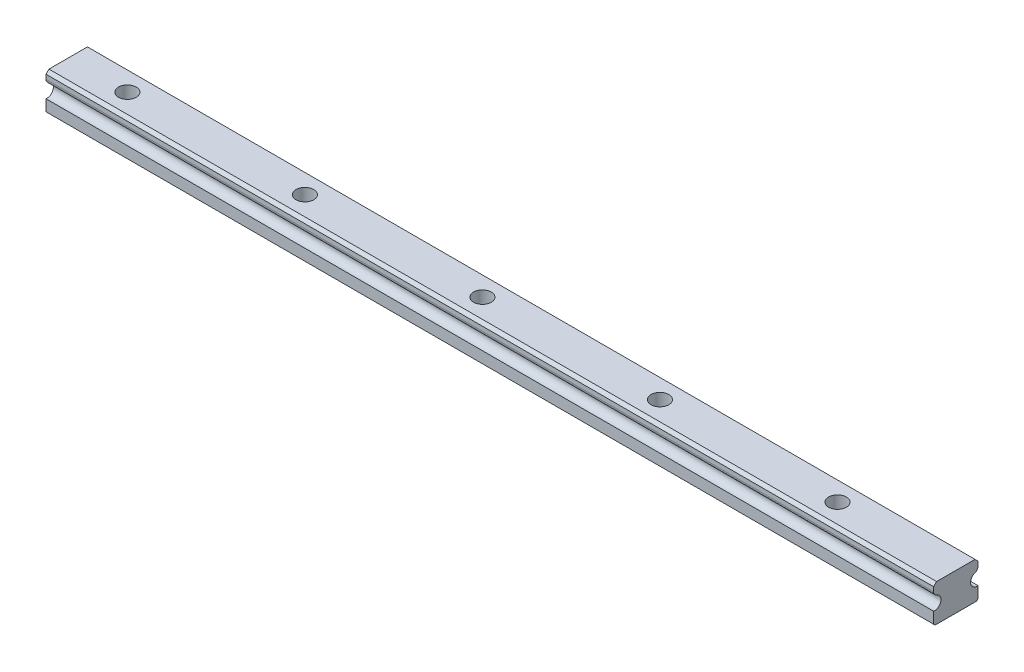
ISO-10303-21;
HEADER;
FILE_DESCRIPTION(('STEP AP214'),'2;1');
FILE_NAME('part.step','',(''),(''),'','','');
FILE_SCHEMA(('AUTOMOTIVE_DESIGN { 1 0 10303 214 1 1 1 1 }'));
ENDSEC;
DATA;
#1=APPLICATION_CONTEXT('core data for automotive mechanical design processes');
#2=APPLICATION_PROTOCOL_DEFINITION('international standard','automotive_design',2000,#1);
#3=PRODUCT_CONTEXT('',#1,'mechanical');
#4=PRODUCT('Part','Part','',(#3));
#5=PRODUCT_RELATED_PRODUCT_CATEGORY('part','',(#4));
#6=PRODUCT_DEFINITION_FORMATION('','',#4);
#7=PRODUCT_DEFINITION_CONTEXT('part definition',#1,'design');
#8=PRODUCT_DEFINITION('design','',#6,#7);
#9=PRODUCT_DEFINITION_SHAPE('','',#8);
#10=(LENGTH_UNIT() NAMED_UNIT(*) SI_UNIT(.MILLI.,.METRE.));
#11=(NAMED_UNIT(*) PLANE_ANGLE_UNIT() SI_UNIT($,.RADIAN.));
#12=(NAMED_UNIT(*) SI_UNIT($,.STERADIAN.) SOLID_ANGLE_UNIT());
#13=UNCERTAINTY_MEASURE_WITH_UNIT(LENGTH_MEASURE(1.E-05),#10,'distance_accuracy_value','');
#14=(GEOMETRIC_REPRESENTATION_CONTEXT(3) GLOBAL_UNCERTAINTY_ASSIGNED_CONTEXT((#13)) GLOBAL_UNIT_ASSIGNED_CONTEXT((#10,
#11,#12)) REPRESENTATION_CONTEXT('',''));
#15=CARTESIAN_POINT('',(0.,0.,0.));
#16=DIRECTION('',(0.,0.,1.));
#17=DIRECTION('',(1.,0.,0.));
#18=AXIS2_PLACEMENT_3D('',#15,#16,#17);
#19=CARTESIAN_POINT('',(476.,21.25,-11.05));
#20=DIRECTION('',(0.,-1.,0.));
#21=DIRECTION('',(0.,0.,-1.));
#22=AXIS2_PLACEMENT_3D('',#19,#20,#21);
#23=PLANE('',#22);
#24=CARTESIAN_POINT('',(0.,21.25,0.));
#25=DIRECTION('',(0.,1.,0.));
#26=DIRECTION('',(0.,0.,1.));
#27=AXIS2_PLACEMENT_3D('',#24,#25,#26);
#28=CIRCLE('',#27,5.1);
#29=CARTESIAN_POINT('',(0.,21.25,5.1));
#30=VERTEX_POINT('',#29);
#31=EDGE_CURVE('E291',#30,#30,#28,.T.);
#32=ORIENTED_EDGE('',*,*,#31,.F.);
#33=EDGE_LOOP('',(#32));
#34=FACE_BOUND('',#33,.T.);
#35=CARTESIAN_POINT('',(102.,21.25,0.));
#36=DIRECTION('',(0.,1.,0.));
#37=DIRECTION('',(0.,0.,1.));
#38=AXIS2_PLACEMENT_3D('',#35,#36,#37);
#39=CIRCLE('',#38,5.1);
#40=CARTESIAN_POINT('',(102.,21.25,5.1));
#41=VERTEX_POINT('',#40);
#42=EDGE_CURVE('E295',#41,#41,#39,.T.);
#43=ORIENTED_EDGE('',*,*,#42,.F.);
#44=EDGE_LOOP('',(#43));
#45=FACE_BOUND('',#44,.T.);
#46=CARTESIAN_POINT('',(204.,21.25,0.));
#47=DIRECTION('',(0.,1.,0.));
#48=DIRECTION('',(0.,0.,1.));
#49=AXIS2_PLACEMENT_3D('',#46,#47,#48);
#50=CIRCLE('',#49,5.1);
#51=CARTESIAN_POINT('',(204.,21.25,5.1));
#52=VERTEX_POINT('',#51);
#53=EDGE_CURVE('E299',#52,#52,#50,.T.);
#54=ORIENTED_EDGE('',*,*,#53,.F.);
#55=EDGE_LOOP('',(#54));
#56=FACE_BOUND('',#55,.T.);
#57=CARTESIAN_POINT('',(306.,21.25,0.));
#58=DIRECTION('',(0.,1.,0.));
#59=DIRECTION('',(0.,0.,1.));
#60=AXIS2_PLACEMENT_3D('',#57,#58,#59);
#61=CIRCLE('',#60,5.1);
#62=CARTESIAN_POINT('',(306.,21.25,5.1));
#63=VERTEX_POINT('',#62);
#64=EDGE_CURVE('E303',#63,#63,#61,.T.);
#65=ORIENTED_EDGE('',*,*,#64,.F.);
#66=EDGE_LOOP('',(#65));
#67=FACE_BOUND('',#66,.T.);
#68=CARTESIAN_POINT('',(408.,21.25,0.));
#69=DIRECTION('',(0.,1.,0.));
#70=DIRECTION('',(0.,0.,1.));
#71=AXIS2_PLACEMENT_3D('',#68,#69,#70);
#72=CIRCLE('',#71,5.1);
#73=CARTESIAN_POINT('',(408.,21.25,5.1));
#74=VERTEX_POINT('',#73);
#75=EDGE_CURVE('E306',#74,#74,#72,.T.);
#76=ORIENTED_EDGE('',*,*,#75,.F.);
#77=EDGE_LOOP('',(#76));
#78=FACE_BOUND('',#77,.T.);
#79=DIRECTION('',(0.,0.,1.));
#80=VECTOR('',#79,1.);
#81=CARTESIAN_POINT('',(-34.,21.25,-11.05));
#82=LINE('',#81,#80);
#83=CARTESIAN_POINT('',(-34.,21.25,-11.05));
#84=VERTEX_POINT('',#83);
#85=CARTESIAN_POINT('',(-34.,21.25,11.05));
#86=VERTEX_POINT('',#85);
#87=EDGE_CURVE('E168',#84,#86,#82,.T.);
#88=ORIENTED_EDGE('',*,*,#87,.T.);
#89=DIRECTION('',(-1.,0.,0.));
#90=VECTOR('',#89,1.);
#91=CARTESIAN_POINT('',(476.,21.25,11.05));
#92=LINE('',#91,#90);
#93=CARTESIAN_POINT('',(476.,21.25,11.05));
#94=VERTEX_POINT('',#93);
#95=EDGE_CURVE('E11',#94,#86,#92,.T.);
#96=ORIENTED_EDGE('',*,*,#95,.F.);
#97=DIRECTION('',(0.,0.,1.));
#98=VECTOR('',#97,1.);
#99=CARTESIAN_POINT('',(476.,21.25,-11.05));
#100=LINE('',#99,#98);
#101=CARTESIAN_POINT('',(476.,21.25,-11.05));
#102=VERTEX_POINT('',#101);
#103=EDGE_CURVE('E195',#102,#94,#100,.T.);
#104=ORIENTED_EDGE('',*,*,#103,.F.);
#105=DIRECTION('',(-1.,0.,0.));
#106=VECTOR('',#105,1.);
#107=CARTESIAN_POINT('',(476.,21.25,-11.05));
#108=LINE('',#107,#106);
#109=EDGE_CURVE('E164',#102,#84,#108,.T.);
#110=ORIENTED_EDGE('',*,*,#109,.T.);
#111=EDGE_LOOP('',(#88,#96,#104,#110));
#112=FACE_BOUND('',#111,.T.);
#113=ADVANCED_FACE('F36',(#34,#45,#56,#67,#78,#112),#23,.F.);
#114=CARTESIAN_POINT('',(476.,21.25,11.05));
#115=DIRECTION('',(0.,-0.707106781186548,-0.707106781186547));
#116=DIRECTION('',(0.,0.707106781186547,-0.707106781186548));
#117=AXIS2_PLACEMENT_3D('',#114,#115,#116);
#118=PLANE('',#117);
#119=DIRECTION('',(0.,-0.707106781186547,0.707106781186548));
#120=VECTOR('',#119,1.);
#121=CARTESIAN_POINT('',(-34.,21.25,11.05));
#122=LINE('',#121,#120);
#123=CARTESIAN_POINT('',(-34.,19.55,12.75));
#124=VERTEX_POINT('',#123);
#125=EDGE_CURVE('E171',#86,#124,#122,.T.);
#126=ORIENTED_EDGE('',*,*,#125,.T.);
#127=DIRECTION('',(-1.,0.,0.));
#128=VECTOR('',#127,1.);
#129=CARTESIAN_POINT('',(476.,19.55,12.75));
#130=LINE('',#129,#128);
#131=CARTESIAN_POINT('',(476.,19.55,12.75));
#132=VERTEX_POINT('',#131);
#133=EDGE_CURVE('E44',#132,#124,#130,.T.);
#134=ORIENTED_EDGE('',*,*,#133,.F.);
#135=DIRECTION('',(0.,-0.707106781186547,0.707106781186548));
#136=VECTOR('',#135,1.);
#137=CARTESIAN_POINT('',(476.,21.25,11.05));
#138=LINE('',#137,#136);
#139=EDGE_CURVE('E113',#94,#132,#138,.T.);
#140=ORIENTED_EDGE('',*,*,#139,.F.);
#141=ORIENTED_EDGE('',*,*,#95,.T.);
#142=EDGE_LOOP('',(#126,#134,#140,#141));
#143=FACE_BOUND('',#142,.T.);
#144=ADVANCED_FACE('F283',(#143),#118,.F.);
#145=CARTESIAN_POINT('',(476.,19.55,12.75));
#146=DIRECTION('',(0.,0.,-1.));
#147=DIRECTION('',(-1.,0.,0.));
#148=AXIS2_PLACEMENT_3D('',#145,#146,#147);
#149=PLANE('',#148);
#150=DIRECTION('',(0.,-1.,0.));
#151=VECTOR('',#150,1.);
#152=CARTESIAN_POINT('',(-34.,19.55,12.75));
#153=LINE('',#152,#151);
#154=CARTESIAN_POINT('',(-34.,17.,12.75));
#155=VERTEX_POINT('',#154);
#156=EDGE_CURVE('E174',#124,#155,#153,.T.);
#157=ORIENTED_EDGE('',*,*,#156,.T.);
#158=DIRECTION('',(-1.,0.,0.));
#159=VECTOR('',#158,1.);
#160=CARTESIAN_POINT('',(476.,17.,12.75));
#161=LINE('',#160,#159);
#162=CARTESIAN_POINT('',(476.,17.,12.75));
#163=VERTEX_POINT('',#162);
#164=EDGE_CURVE('E220',#163,#155,#161,.T.);
#165=ORIENTED_EDGE('',*,*,#164,.F.);
#166=DIRECTION('',(0.,-1.,0.));
#167=VECTOR('',#166,1.);
#168=CARTESIAN_POINT('',(476.,19.55,12.75));
#169=LINE('',#168,#167);
#170=EDGE_CURVE('E228',#132,#163,#169,.T.);
#171=ORIENTED_EDGE('',*,*,#170,.F.);
#172=ORIENTED_EDGE('',*,*,#133,.T.);
#173=EDGE_LOOP('',(#157,#165,#171,#172));
#174=FACE_BOUND('',#173,.T.);
#175=ADVANCED_FACE('F226',(#174),#149,.F.);
#176=CARTESIAN_POINT('',(476.,17.,10.2));
#177=DIRECTION('',(-1.,0.,0.));
#178=DIRECTION('',(0.,0.,1.));
#179=AXIS2_PLACEMENT_3D('',#176,#177,#178);
#180=CYLINDRICAL_SURFACE('',#179,2.55);
#181=CARTESIAN_POINT('',(-34.,17.,10.2));
#182=DIRECTION('',(1.,0.,0.));
#183=DIRECTION('',(0.,0.,-1.));
#184=AXIS2_PLACEMENT_3D('',#181,#182,#183);
#185=CIRCLE('',#184,2.55);
#186=CARTESIAN_POINT('',(-34.,14.5878378378378,11.027027027027));
#187=VERTEX_POINT('',#186);
#188=EDGE_CURVE('E176',#155,#187,#185,.T.);
#189=ORIENTED_EDGE('',*,*,#188,.T.);
#190=DIRECTION('',(-1.,0.,0.));
#191=VECTOR('',#190,1.);
#192=CARTESIAN_POINT('',(476.,14.5878378378378,11.027027027027));
#193=LINE('',#192,#191);
#194=CARTESIAN_POINT('',(476.,14.5878378378378,11.027027027027));
#195=VERTEX_POINT('',#194);
#196=EDGE_CURVE('E217',#195,#187,#193,.T.);
#197=ORIENTED_EDGE('',*,*,#196,.F.);
#198=CARTESIAN_POINT('',(476.,17.,10.2));
#199=DIRECTION('',(1.,0.,0.));
#200=DIRECTION('',(0.,0.,-1.));
#201=AXIS2_PLACEMENT_3D('',#198,#199,#200);
#202=CIRCLE('',#201,2.55);
#203=EDGE_CURVE('E246',#163,#195,#202,.T.);
#204=ORIENTED_EDGE('',*,*,#203,.F.);
#205=ORIENTED_EDGE('',*,*,#164,.T.);
#206=EDGE_LOOP('',(#189,#197,#204,#205));
#207=FACE_BOUND('',#206,.T.);
#208=ADVANCED_FACE('F237',(#207),#180,.T.);
#209=CARTESIAN_POINT('',(476.,11.05,12.24));
#210=DIRECTION('',(-1.,0.,0.));
#211=DIRECTION('',(0.,0.,1.));
#212=AXIS2_PLACEMENT_3D('',#209,#210,#211);
#213=CYLINDRICAL_SURFACE('',#212,3.74);
#214=CARTESIAN_POINT('',(-34.,11.05,12.24));
#215=DIRECTION('',(-1.,0.,0.));
#216=DIRECTION('',(0.,0.,-1.));
#217=AXIS2_PLACEMENT_3D('',#214,#215,#216);
#218=CIRCLE('',#217,3.74);
#219=CARTESIAN_POINT('',(-34.,7.34493589799043,12.75));
#220=VERTEX_POINT('',#219);
#221=EDGE_CURVE('E178',#187,#220,#218,.T.);
#222=ORIENTED_EDGE('',*,*,#221,.T.);
#223=DIRECTION('',(-1.,0.,0.));
#224=VECTOR('',#223,1.);
#225=CARTESIAN_POINT('',(476.,7.34493589799043,12.75));
#226=LINE('',#225,#224);
#227=CARTESIAN_POINT('',(476.,7.34493589799043,12.75));
#228=VERTEX_POINT('',#227);
#229=EDGE_CURVE('E214',#228,#220,#226,.T.);
#230=ORIENTED_EDGE('',*,*,#229,.F.);
#231=CARTESIAN_POINT('',(476.,11.05,12.24));
#232=DIRECTION('',(-1.,0.,0.));
#233=DIRECTION('',(0.,0.,-1.));
#234=AXIS2_PLACEMENT_3D('',#231,#232,#233);
#235=CIRCLE('',#234,3.74);
#236=EDGE_CURVE('E243',#195,#228,#235,.T.);
#237=ORIENTED_EDGE('',*,*,#236,.F.);
#238=ORIENTED_EDGE('',*,*,#196,.T.);
#239=EDGE_LOOP('',(#222,#230,#237,#238));
#240=FACE_BOUND('',#239,.T.);
#241=ADVANCED_FACE('F241',(#240),#213,.F.);
#242=CARTESIAN_POINT('',(476.,7.34493589799043,12.75));
#243=DIRECTION('',(0.,0.,-1.));
#244=DIRECTION('',(-1.,0.,0.));
#245=AXIS2_PLACEMENT_3D('',#242,#243,#244);
#246=PLANE('',#245);
#247=DIRECTION('',(0.,-1.,0.));
#248=VECTOR('',#247,1.);
#249=CARTESIAN_POINT('',(-34.,7.34493589799043,12.75));
#250=LINE('',#249,#248);
#251=CARTESIAN_POINT('',(-34.,0.850000000000001,12.75));
#252=VERTEX_POINT('',#251);
#253=EDGE_CURVE('E180',#220,#252,#250,.T.);
#254=ORIENTED_EDGE('',*,*,#253,.T.);
#255=DIRECTION('',(-1.,0.,0.));
#256=VECTOR('',#255,1.);
#257=CARTESIAN_POINT('',(476.,0.850000000000001,12.75));
#258=LINE('',#257,#256);
#259=CARTESIAN_POINT('',(476.,0.850000000000001,12.75));
#260=VERTEX_POINT('',#259);
#261=EDGE_CURVE('E211',#260,#252,#258,.T.);
#262=ORIENTED_EDGE('',*,*,#261,.F.);
#263=DIRECTION('',(0.,-1.,0.));
#264=VECTOR('',#263,1.);
#265=CARTESIAN_POINT('',(476.,7.34493589799043,12.75));
#266=LINE('',#265,#264);
#267=EDGE_CURVE('E245',#228,#260,#266,.T.);
#268=ORIENTED_EDGE('',*,*,#267,.F.);
#269=ORIENTED_EDGE('',*,*,#229,.T.);
#270=EDGE_LOOP('',(#254,#262,#268,#269));
#271=FACE_BOUND('',#270,.T.);
#272=ADVANCED_FACE('F549',(#271),#246,.F.);
#273=CARTESIAN_POINT('',(476.,0.850000000000001,12.75));
#274=DIRECTION('',(0.,0.707106781186548,-0.707106781186548));
#275=DIRECTION('',(0.,0.707106781186548,0.707106781186548));
#276=AXIS2_PLACEMENT_3D('',#273,#274,#275);
#277=PLANE('',#276);
#278=DIRECTION('',(0.,-0.707106781186547,-0.707106781186547));
#279=VECTOR('',#278,1.);
#280=CARTESIAN_POINT('',(-34.,0.850000000000001,12.75));
#281=LINE('',#280,#279);
#282=CARTESIAN_POINT('',(-34.,0.,11.9));
#283=VERTEX_POINT('',#282);
#284=EDGE_CURVE('E182',#252,#283,#281,.T.);
#285=ORIENTED_EDGE('',*,*,#284,.T.);
#286=DIRECTION('',(-1.,0.,0.));
#287=VECTOR('',#286,1.);
#288=CARTESIAN_POINT('',(476.,0.,11.9));
#289=LINE('',#288,#287);
#290=CARTESIAN_POINT('',(476.,0.,11.9));
#291=VERTEX_POINT('',#290);
#292=EDGE_CURVE('E208',#291,#283,#289,.T.);
#293=ORIENTED_EDGE('',*,*,#292,.F.);
#294=DIRECTION('',(0.,-0.707106781186547,-0.707106781186547));
#295=VECTOR('',#294,1.);
#296=CARTESIAN_POINT('',(476.,0.850000000000001,12.75));
#297=LINE('',#296,#295);
#298=EDGE_CURVE('E248',#260,#291,#297,.T.);
#299=ORIENTED_EDGE('',*,*,#298,.F.);
#300=ORIENTED_EDGE('',*,*,#261,.T.);
#301=EDGE_LOOP('',(#285,#293,#299,#300));
#302=FACE_BOUND('',#301,.T.);
#303=ADVANCED_FACE('F539',(#302),#277,.F.);
#304=CARTESIAN_POINT('',(476.,0.,11.9));
#305=DIRECTION('',(0.,1.,0.));
#306=DIRECTION('',(0.,0.,1.));
#307=AXIS2_PLACEMENT_3D('',#304,#305,#306);
#308=PLANE('',#307);
#309=CARTESIAN_POINT('',(0.,0.,0.));
#310=DIRECTION('',(0.,1.,0.));
#311=DIRECTION('',(0.,0.,1.));
#312=AXIS2_PLACEMENT_3D('',#309,#310,#311);
#313=CIRCLE('',#312,2.975);
#314=CARTESIAN_POINT('',(0.,0.,2.975));
#315=VERTEX_POINT('',#314);
#316=EDGE_CURVE('E497',#315,#315,#313,.T.);
#317=ORIENTED_EDGE('',*,*,#316,.T.);
#318=EDGE_LOOP('',(#317));
#319=FACE_BOUND('',#318,.T.);
#320=CARTESIAN_POINT('',(102.,0.,0.));
#321=DIRECTION('',(0.,1.,0.));
#322=DIRECTION('',(0.,0.,1.));
#323=AXIS2_PLACEMENT_3D('',#320,#321,#322);
#324=CIRCLE('',#323,2.97499999999999);
#325=CARTESIAN_POINT('',(102.,0.,2.97499999999999));
#326=VERTEX_POINT('',#325);
#327=EDGE_CURVE('E507',#326,#326,#324,.T.);
#328=ORIENTED_EDGE('',*,*,#327,.T.);
#329=EDGE_LOOP('',(#328));
#330=FACE_BOUND('',#329,.T.);
#331=CARTESIAN_POINT('',(204.,0.,0.));
#332=DIRECTION('',(0.,1.,0.));
#333=DIRECTION('',(0.,0.,1.));
#334=AXIS2_PLACEMENT_3D('',#331,#332,#333);
#335=CIRCLE('',#334,2.975);
#336=CARTESIAN_POINT('',(204.,0.,2.975));
#337=VERTEX_POINT('',#336);
#338=EDGE_CURVE('E517',#337,#337,#335,.T.);
#339=ORIENTED_EDGE('',*,*,#338,.T.);
#340=EDGE_LOOP('',(#339));
#341=FACE_BOUND('',#340,.T.);
#342=CARTESIAN_POINT('',(306.,0.,0.));
#343=DIRECTION('',(0.,1.,0.));
#344=DIRECTION('',(0.,0.,1.));
#345=AXIS2_PLACEMENT_3D('',#342,#343,#344);
#346=CIRCLE('',#345,2.975);
#347=CARTESIAN_POINT('',(306.,0.,2.975));
#348=VERTEX_POINT('',#347);
#349=EDGE_CURVE('E309',#348,#348,#346,.T.);
#350=ORIENTED_EDGE('',*,*,#349,.T.);
#351=EDGE_LOOP('',(#350));
#352=FACE_BOUND('',#351,.T.);
#353=CARTESIAN_POINT('',(408.,0.,0.));
#354=DIRECTION('',(0.,1.,0.));
#355=DIRECTION('',(0.,0.,1.));
#356=AXIS2_PLACEMENT_3D('',#353,#354,#355);
#357=CIRCLE('',#356,2.975);
#358=CARTESIAN_POINT('',(408.,0.,2.975));
#359=VERTEX_POINT('',#358);
#360=EDGE_CURVE('E172',#359,#359,#357,.T.);
#361=ORIENTED_EDGE('',*,*,#360,.T.);
#362=EDGE_LOOP('',(#361));
#363=FACE_BOUND('',#362,.T.);
#364=DIRECTION('',(0.,0.,-1.));
#365=VECTOR('',#364,1.);
#366=CARTESIAN_POINT('',(-34.,0.,11.9));
#367=LINE('',#366,#365);
#368=CARTESIAN_POINT('',(-34.,0.,-11.9));
#369=VERTEX_POINT('',#368);
#370=EDGE_CURVE('E184',#283,#369,#367,.T.);
#371=ORIENTED_EDGE('',*,*,#370,.T.);
#372=DIRECTION('',(-1.,0.,0.));
#373=VECTOR('',#372,1.);
#374=CARTESIAN_POINT('',(476.,0.,-11.9));
#375=LINE('',#374,#373);
#376=CARTESIAN_POINT('',(476.,0.,-11.9));
#377=VERTEX_POINT('',#376);
#378=EDGE_CURVE('E205',#377,#369,#375,.T.);
#379=ORIENTED_EDGE('',*,*,#378,.F.);
#380=DIRECTION('',(0.,0.,-1.));
#381=VECTOR('',#380,1.);
#382=CARTESIAN_POINT('',(476.,0.,11.9));
#383=LINE('',#382,#381);
#384=EDGE_CURVE('E254',#291,#377,#383,.T.);
#385=ORIENTED_EDGE('',*,*,#384,.F.);
#386=ORIENTED_EDGE('',*,*,#292,.T.);
#387=EDGE_LOOP('',(#371,#379,#385,#386));
#388=FACE_BOUND('',#387,.T.);
#389=ADVANCED_FACE('F326',(#319,#330,#341,#352,#363,#388),#308,.F.);
#390=CARTESIAN_POINT('',(476.,0.850000000000001,-12.75));
#391=DIRECTION('',(0.,0.707106781186548,0.707106781186548));
#392=DIRECTION('',(0.,-0.707106781186548,0.707106781186548));
#393=AXIS2_PLACEMENT_3D('',#390,#391,#392);
#394=PLANE('',#393);
#395=DIRECTION('',(0.,0.707106781186547,-0.707106781186547));
#396=VECTOR('',#395,1.);
#397=CARTESIAN_POINT('',(-34.,0.850000000000001,-12.75));
#398=LINE('',#397,#396);
#399=CARTESIAN_POINT('',(-34.,0.850000000000001,-12.75));
#400=VERTEX_POINT('',#399);
#401=EDGE_CURVE('E186',#369,#400,#398,.T.);
#402=ORIENTED_EDGE('',*,*,#401,.T.);
#403=DIRECTION('',(-1.,0.,0.));
#404=VECTOR('',#403,1.);
#405=CARTESIAN_POINT('',(476.,0.850000000000001,-12.75));
#406=LINE('',#405,#404);
#407=CARTESIAN_POINT('',(476.,0.850000000000001,-12.75));
#408=VERTEX_POINT('',#407);
#409=EDGE_CURVE('E202',#408,#400,#406,.T.);
#410=ORIENTED_EDGE('',*,*,#409,.F.);
#411=DIRECTION('',(0.,0.707106781186547,-0.707106781186547));
#412=VECTOR('',#411,1.);
#413=CARTESIAN_POINT('',(476.,0.850000000000001,-12.75));
#414=LINE('',#413,#412);
#415=EDGE_CURVE('E256',#377,#408,#414,.T.);
#416=ORIENTED_EDGE('',*,*,#415,.F.);
#417=ORIENTED_EDGE('',*,*,#378,.T.);
#418=EDGE_LOOP('',(#402,#410,#416,#417));
#419=FACE_BOUND('',#418,.T.);
#420=ADVANCED_FACE('F538',(#419),#394,.F.);
#421=CARTESIAN_POINT('',(476.,7.34493589799043,-12.75));
#422=DIRECTION('',(0.,0.,1.));
#423=DIRECTION('',(1.,0.,0.));
#424=AXIS2_PLACEMENT_3D('',#421,#422,#423);
#425=PLANE('',#424);
#426=DIRECTION('',(0.,1.,0.));
#427=VECTOR('',#426,1.);
#428=CARTESIAN_POINT('',(-34.,7.34493589799043,-12.75));
#429=LINE('',#428,#427);
#430=CARTESIAN_POINT('',(-34.,7.34493589799043,-12.75));
#431=VERTEX_POINT('',#430);
#432=EDGE_CURVE('E188',#400,#431,#429,.T.);
#433=ORIENTED_EDGE('',*,*,#432,.T.);
#434=DIRECTION('',(-1.,0.,0.));
#435=VECTOR('',#434,1.);
#436=CARTESIAN_POINT('',(476.,7.34493589799043,-12.75));
#437=LINE('',#436,#435);
#438=CARTESIAN_POINT('',(476.,7.34493589799043,-12.75));
#439=VERTEX_POINT('',#438);
#440=EDGE_CURVE('E199',#439,#431,#437,.T.);
#441=ORIENTED_EDGE('',*,*,#440,.F.);
#442=DIRECTION('',(0.,1.,0.));
#443=VECTOR('',#442,1.);
#444=CARTESIAN_POINT('',(476.,7.34493589799043,-12.75));
#445=LINE('',#444,#443);
#446=EDGE_CURVE('E258',#408,#439,#445,.T.);
#447=ORIENTED_EDGE('',*,*,#446,.F.);
#448=ORIENTED_EDGE('',*,*,#409,.T.);
#449=EDGE_LOOP('',(#433,#441,#447,#448));
#450=FACE_BOUND('',#449,.T.);
#451=ADVANCED_FACE('F264',(#450),#425,.F.);
#452=CARTESIAN_POINT('',(476.,11.05,-12.24));
#453=DIRECTION('',(-1.,0.,0.));
#454=DIRECTION('',(0.,0.,1.));
#455=AXIS2_PLACEMENT_3D('',#452,#453,#454);
#456=CYLINDRICAL_SURFACE('',#455,3.74);
#457=CARTESIAN_POINT('',(-34.,11.05,-12.24));
#458=DIRECTION('',(-1.,0.,0.));
#459=DIRECTION('',(0.,0.,1.));
#460=AXIS2_PLACEMENT_3D('',#457,#458,#459);
#461=CIRCLE('',#460,3.74);
#462=CARTESIAN_POINT('',(-34.,14.5878378378378,-11.027027027027));
#463=VERTEX_POINT('',#462);
#464=EDGE_CURVE('E190',#431,#463,#461,.T.);
#465=ORIENTED_EDGE('',*,*,#464,.T.);
#466=DIRECTION('',(-1.,0.,0.));
#467=VECTOR('',#466,1.);
#468=CARTESIAN_POINT('',(476.,14.5878378378378,-11.027027027027));
#469=LINE('',#468,#467);
#470=CARTESIAN_POINT('',(476.,14.5878378378378,-11.027027027027));
#471=VERTEX_POINT('',#470);
#472=EDGE_CURVE('E159',#471,#463,#469,.T.);
#473=ORIENTED_EDGE('',*,*,#472,.F.);
#474=CARTESIAN_POINT('',(476.,11.05,-12.24));
#475=DIRECTION('',(-1.,0.,0.));
#476=DIRECTION('',(0.,0.,1.));
#477=AXIS2_PLACEMENT_3D('',#474,#475,#476);
#478=CIRCLE('',#477,3.74);
#479=EDGE_CURVE('E150',#439,#471,#478,.T.);
#480=ORIENTED_EDGE('',*,*,#479,.F.);
#481=ORIENTED_EDGE('',*,*,#440,.T.);
#482=EDGE_LOOP('',(#465,#473,#480,#481));
#483=FACE_BOUND('',#482,.T.);
#484=ADVANCED_FACE('F268',(#483),#456,.F.);
#485=CARTESIAN_POINT('',(476.,17.,-10.2));
#486=DIRECTION('',(-1.,0.,0.));
#487=DIRECTION('',(0.,0.,1.));
#488=AXIS2_PLACEMENT_3D('',#485,#486,#487);
#489=CYLINDRICAL_SURFACE('',#488,2.55);
#490=CARTESIAN_POINT('',(-34.,17.,-10.2));
#491=DIRECTION('',(1.,0.,0.));
#492=DIRECTION('',(0.,0.,1.));
#493=AXIS2_PLACEMENT_3D('',#490,#491,#492);
#494=CIRCLE('',#493,2.55);
#495=CARTESIAN_POINT('',(-34.,17.,-12.75));
#496=VERTEX_POINT('',#495);
#497=EDGE_CURVE('E158',#463,#496,#494,.T.);
#498=ORIENTED_EDGE('',*,*,#497,.T.);
#499=DIRECTION('',(-1.,0.,0.));
#500=VECTOR('',#499,1.);
#501=CARTESIAN_POINT('',(476.,17.,-12.75));
#502=LINE('',#501,#500);
#503=CARTESIAN_POINT('',(476.,17.,-12.75));
#504=VERTEX_POINT('',#503);
#505=EDGE_CURVE('E155',#504,#496,#502,.T.);
#506=ORIENTED_EDGE('',*,*,#505,.F.);
#507=CARTESIAN_POINT('',(476.,17.,-10.2));
#508=DIRECTION('',(1.,0.,0.));
#509=DIRECTION('',(0.,0.,1.));
#510=AXIS2_PLACEMENT_3D('',#507,#508,#509);
#511=CIRCLE('',#510,2.55);
#512=EDGE_CURVE('E144',#471,#504,#511,.T.);
#513=ORIENTED_EDGE('',*,*,#512,.F.);
#514=ORIENTED_EDGE('',*,*,#472,.T.);
#515=EDGE_LOOP('',(#498,#506,#513,#514));
#516=FACE_BOUND('',#515,.T.);
#517=ADVANCED_FACE('F156',(#516),#489,.T.);
#518=CARTESIAN_POINT('',(476.,19.55,-12.75));
#519=DIRECTION('',(0.,0.,1.));
#520=DIRECTION('',(1.,0.,0.));
#521=AXIS2_PLACEMENT_3D('',#518,#519,#520);
#522=PLANE('',#521);
#523=DIRECTION('',(0.,1.,0.));
#524=VECTOR('',#523,1.);
#525=CARTESIAN_POINT('',(-34.,19.55,-12.75));
#526=LINE('',#525,#524);
#527=CARTESIAN_POINT('',(-34.,19.55,-12.75));
#528=VERTEX_POINT('',#527);
#529=EDGE_CURVE('E99',#496,#528,#526,.T.);
#530=ORIENTED_EDGE('',*,*,#529,.T.);
#531=DIRECTION('',(-1.,0.,0.));
#532=VECTOR('',#531,1.);
#533=CARTESIAN_POINT('',(476.,19.55,-12.75));
#534=LINE('',#533,#532);
#535=CARTESIAN_POINT('',(476.,19.55,-12.75));
#536=VERTEX_POINT('',#535);
#537=EDGE_CURVE('E160',#536,#528,#534,.T.);
#538=ORIENTED_EDGE('',*,*,#537,.F.);
#539=DIRECTION('',(0.,1.,0.));
#540=VECTOR('',#539,1.);
#541=CARTESIAN_POINT('',(476.,19.55,-12.75));
#542=LINE('',#541,#540);
#543=EDGE_CURVE('E148',#504,#536,#542,.T.);
#544=ORIENTED_EDGE('',*,*,#543,.F.);
#545=ORIENTED_EDGE('',*,*,#505,.T.);
#546=EDGE_LOOP('',(#530,#538,#544,#545));
#547=FACE_BOUND('',#546,.T.);
#548=ADVANCED_FACE('F162',(#547),#522,.F.);
#549=CARTESIAN_POINT('',(476.,21.25,-11.05));
#550=DIRECTION('',(0.,-0.707106781186548,0.707106781186547));
#551=DIRECTION('',(0.,-0.707106781186547,-0.707106781186548));
#552=AXIS2_PLACEMENT_3D('',#549,#550,#551);
#553=PLANE('',#552);
#554=DIRECTION('',(0.,0.707106781186547,0.707106781186548));
#555=VECTOR('',#554,1.);
#556=CARTESIAN_POINT('',(-34.,21.25,-11.05));
#557=LINE('',#556,#555);
#558=EDGE_CURVE('E105',#528,#84,#557,.T.);
#559=ORIENTED_EDGE('',*,*,#558,.T.);
#560=ORIENTED_EDGE('',*,*,#109,.F.);
#561=DIRECTION('',(0.,0.707106781186547,0.707106781186548));
#562=VECTOR('',#561,1.);
#563=CARTESIAN_POINT('',(476.,21.25,-11.05));
#564=LINE('',#563,#562);
#565=EDGE_CURVE('E52',#536,#102,#564,.T.);
#566=ORIENTED_EDGE('',*,*,#565,.F.);
#567=ORIENTED_EDGE('',*,*,#537,.T.);
#568=EDGE_LOOP('',(#559,#560,#566,#567));
#569=FACE_BOUND('',#568,.T.);
#570=ADVANCED_FACE('F272',(#569),#553,.F.);
#571=CARTESIAN_POINT('',(476.,17.,10.2));
#572=DIRECTION('',(1.,0.,0.));
#573=DIRECTION('',(0.,0.,-1.));
#574=AXIS2_PLACEMENT_3D('',#571,#572,#573);
#575=PLANE('',#574);
#576=ORIENTED_EDGE('',*,*,#103,.T.);
#577=ORIENTED_EDGE('',*,*,#139,.T.);
#578=ORIENTED_EDGE('',*,*,#170,.T.);
#579=ORIENTED_EDGE('',*,*,#203,.T.);
#580=ORIENTED_EDGE('',*,*,#236,.T.);
#581=ORIENTED_EDGE('',*,*,#267,.T.);
#582=ORIENTED_EDGE('',*,*,#298,.T.);
#583=ORIENTED_EDGE('',*,*,#384,.T.);
#584=ORIENTED_EDGE('',*,*,#415,.T.);
#585=ORIENTED_EDGE('',*,*,#446,.T.);
#586=ORIENTED_EDGE('',*,*,#479,.T.);
#587=ORIENTED_EDGE('',*,*,#512,.T.);
#588=ORIENTED_EDGE('',*,*,#543,.T.);
#589=ORIENTED_EDGE('',*,*,#565,.T.);
#590=EDGE_LOOP('',(#576,#577,#578,#579,#580,#581,#582,#583,#584,#585,#586,#587,#588,#589));
#591=FACE_BOUND('',#590,.T.);
#592=ADVANCED_FACE('F146',(#591),#575,.T.);
#593=CARTESIAN_POINT('',(-34.,17.,10.2));
#594=DIRECTION('',(1.,0.,0.));
#595=DIRECTION('',(0.,0.,-1.));
#596=AXIS2_PLACEMENT_3D('',#593,#594,#595);
#597=PLANE('',#596);
#598=ORIENTED_EDGE('',*,*,#87,.F.);
#599=ORIENTED_EDGE('',*,*,#558,.F.);
#600=ORIENTED_EDGE('',*,*,#529,.F.);
#601=ORIENTED_EDGE('',*,*,#497,.F.);
#602=ORIENTED_EDGE('',*,*,#464,.F.);
#603=ORIENTED_EDGE('',*,*,#432,.F.);
#604=ORIENTED_EDGE('',*,*,#401,.F.);
#605=ORIENTED_EDGE('',*,*,#370,.F.);
#606=ORIENTED_EDGE('',*,*,#284,.F.);
#607=ORIENTED_EDGE('',*,*,#253,.F.);
#608=ORIENTED_EDGE('',*,*,#221,.F.);
#609=ORIENTED_EDGE('',*,*,#188,.F.);
#610=ORIENTED_EDGE('',*,*,#156,.F.);
#611=ORIENTED_EDGE('',*,*,#125,.F.);
#612=EDGE_LOOP('',(#598,#599,#600,#601,#602,#603,#604,#605,#606,#607,#608,#609,#610,#611));
#613=FACE_BOUND('',#612,.T.);
#614=ADVANCED_FACE('F232',(#613),#597,.F.);
#615=CARTESIAN_POINT('',(408.,21.25,0.));
#616=DIRECTION('',(0.,1.,0.));
#617=DIRECTION('',(0.,0.,1.));
#618=AXIS2_PLACEMENT_3D('',#615,#616,#617);
#619=CYLINDRICAL_SURFACE('',#618,2.975);
#620=ORIENTED_EDGE('',*,*,#360,.F.);
#621=EDGE_LOOP('',(#620));
#622=FACE_BOUND('',#621,.T.);
#623=CARTESIAN_POINT('',(408.,13.6,0.));
#624=DIRECTION('',(0.,1.,0.));
#625=DIRECTION('',(0.,0.,1.));
#626=AXIS2_PLACEMENT_3D('',#623,#624,#625);
#627=CIRCLE('',#626,2.975);
#628=CARTESIAN_POINT('',(408.,13.6,2.975));
#629=VERTEX_POINT('',#628);
#630=EDGE_CURVE('E312',#629,#629,#627,.T.);
#631=ORIENTED_EDGE('',*,*,#630,.T.);
#632=EDGE_LOOP('',(#631));
#633=FACE_BOUND('',#632,.T.);
#634=ADVANCED_FACE('F329',(#622,#633),#619,.F.);
#635=CARTESIAN_POINT('',(410.975,13.6,0.));
#636=DIRECTION('',(0.,-1.,0.));
#637=DIRECTION('',(0.,0.,-1.));
#638=AXIS2_PLACEMENT_3D('',#635,#636,#637);
#639=PLANE('',#638);
#640=ORIENTED_EDGE('',*,*,#630,.F.);
#641=EDGE_LOOP('',(#640));
#642=FACE_BOUND('',#641,.T.);
#643=CARTESIAN_POINT('',(408.,13.6,0.));
#644=DIRECTION('',(0.,1.,0.));
#645=DIRECTION('',(0.,0.,1.));
#646=AXIS2_PLACEMENT_3D('',#643,#644,#645);
#647=CIRCLE('',#646,5.1);
#648=CARTESIAN_POINT('',(408.,13.6,5.1));
#649=VERTEX_POINT('',#648);
#650=EDGE_CURVE('E308',#649,#649,#647,.T.);
#651=ORIENTED_EDGE('',*,*,#650,.T.);
#652=EDGE_LOOP('',(#651));
#653=FACE_BOUND('',#652,.T.);
#654=ADVANCED_FACE('F332',(#642,#653),#639,.F.);
#655=CARTESIAN_POINT('',(408.,21.25,0.));
#656=DIRECTION('',(0.,1.,0.));
#657=DIRECTION('',(0.,0.,1.));
#658=AXIS2_PLACEMENT_3D('',#655,#656,#657);
#659=CYLINDRICAL_SURFACE('',#658,5.1);
#660=ORIENTED_EDGE('',*,*,#650,.F.);
#661=EDGE_LOOP('',(#660));
#662=FACE_BOUND('',#661,.T.);
#663=ORIENTED_EDGE('',*,*,#75,.T.);
#664=EDGE_LOOP('',(#663));
#665=FACE_BOUND('',#664,.T.);
#666=ADVANCED_FACE('F338',(#662,#665),#659,.F.);
#667=CARTESIAN_POINT('',(306.,21.25,0.));
#668=DIRECTION('',(0.,1.,0.));
#669=DIRECTION('',(0.,0.,1.));
#670=AXIS2_PLACEMENT_3D('',#667,#668,#669);
#671=CYLINDRICAL_SURFACE('',#670,2.975);
#672=ORIENTED_EDGE('',*,*,#349,.F.);
#673=EDGE_LOOP('',(#672));
#674=FACE_BOUND('',#673,.T.);
#675=CARTESIAN_POINT('',(306.,13.6,0.));
#676=DIRECTION('',(0.,1.,0.));
#677=DIRECTION('',(0.,0.,1.));
#678=AXIS2_PLACEMENT_3D('',#675,#676,#677);
#679=CIRCLE('',#678,2.975);
#680=CARTESIAN_POINT('',(306.,13.6,2.975));
#681=VERTEX_POINT('',#680);
#682=EDGE_CURVE('E315',#681,#681,#679,.T.);
#683=ORIENTED_EDGE('',*,*,#682,.T.);
#684=EDGE_LOOP('',(#683));
#685=FACE_BOUND('',#684,.T.);
#686=ADVANCED_FACE('F343',(#674,#685),#671,.F.);
#687=CARTESIAN_POINT('',(308.975,13.6,0.));
#688=DIRECTION('',(0.,-1.,0.));
#689=DIRECTION('',(0.,0.,-1.));
#690=AXIS2_PLACEMENT_3D('',#687,#688,#689);
#691=PLANE('',#690);
#692=ORIENTED_EDGE('',*,*,#682,.F.);
#693=EDGE_LOOP('',(#692));
#694=FACE_BOUND('',#693,.T.);
#695=CARTESIAN_POINT('',(306.,13.6,0.));
#696=DIRECTION('',(0.,1.,0.));
#697=DIRECTION('',(0.,0.,1.));
#698=AXIS2_PLACEMENT_3D('',#695,#696,#697);
#699=CIRCLE('',#698,5.1);
#700=CARTESIAN_POINT('',(306.,13.6,5.1));
#701=VERTEX_POINT('',#700);
#702=EDGE_CURVE('E521',#701,#701,#699,.T.);
#703=ORIENTED_EDGE('',*,*,#702,.T.);
#704=EDGE_LOOP('',(#703));
#705=FACE_BOUND('',#704,.T.);
#706=ADVANCED_FACE('F348',(#694,#705),#691,.F.);
#707=CARTESIAN_POINT('',(306.,21.25,0.));
#708=DIRECTION('',(0.,1.,0.));
#709=DIRECTION('',(0.,0.,1.));
#710=AXIS2_PLACEMENT_3D('',#707,#708,#709);
#711=CYLINDRICAL_SURFACE('',#710,5.1);
#712=ORIENTED_EDGE('',*,*,#702,.F.);
#713=EDGE_LOOP('',(#712));
#714=FACE_BOUND('',#713,.T.);
#715=ORIENTED_EDGE('',*,*,#64,.T.);
#716=EDGE_LOOP('',(#715));
#717=FACE_BOUND('',#716,.T.);
#718=ADVANCED_FACE('F384',(#714,#717),#711,.F.);
#719=CARTESIAN_POINT('',(204.,21.25,0.));
#720=DIRECTION('',(0.,1.,0.));
#721=DIRECTION('',(0.,0.,1.));
#722=AXIS2_PLACEMENT_3D('',#719,#720,#721);
#723=CYLINDRICAL_SURFACE('',#722,2.975);
#724=ORIENTED_EDGE('',*,*,#338,.F.);
#725=EDGE_LOOP('',(#724));
#726=FACE_BOUND('',#725,.T.);
#727=CARTESIAN_POINT('',(204.,13.6,0.));
#728=DIRECTION('',(0.,1.,0.));
#729=DIRECTION('',(0.,0.,1.));
#730=AXIS2_PLACEMENT_3D('',#727,#728,#729);
#731=CIRCLE('',#730,2.975);
#732=CARTESIAN_POINT('',(204.,13.6,2.975));
#733=VERTEX_POINT('',#732);
#734=EDGE_CURVE('E514',#733,#733,#731,.T.);
#735=ORIENTED_EDGE('',*,*,#734,.T.);
#736=EDGE_LOOP('',(#735));
#737=FACE_BOUND('',#736,.T.);
#738=ADVANCED_FACE('F393',(#726,#737),#723,.F.);
#739=CARTESIAN_POINT('',(206.975,13.6,0.));
#740=DIRECTION('',(0.,-1.,0.));
#741=DIRECTION('',(0.,0.,-1.));
#742=AXIS2_PLACEMENT_3D('',#739,#740,#741);
#743=PLANE('',#742);
#744=ORIENTED_EDGE('',*,*,#734,.F.);
#745=EDGE_LOOP('',(#744));
#746=FACE_BOUND('',#745,.T.);
#747=CARTESIAN_POINT('',(204.,13.6,0.));
#748=DIRECTION('',(0.,1.,0.));
#749=DIRECTION('',(0.,0.,1.));
#750=AXIS2_PLACEMENT_3D('',#747,#748,#749);
#751=CIRCLE('',#750,5.1);
#752=CARTESIAN_POINT('',(204.,13.6,5.1));
#753=VERTEX_POINT('',#752);
#754=EDGE_CURVE('E511',#753,#753,#751,.T.);
#755=ORIENTED_EDGE('',*,*,#754,.T.);
#756=EDGE_LOOP('',(#755));
#757=FACE_BOUND('',#756,.T.);
#758=ADVANCED_FACE('F403',(#746,#757),#743,.F.);
#759=CARTESIAN_POINT('',(204.,21.25,0.));
#760=DIRECTION('',(0.,1.,0.));
#761=DIRECTION('',(0.,0.,1.));
#762=AXIS2_PLACEMENT_3D('',#759,#760,#761);
#763=CYLINDRICAL_SURFACE('',#762,5.1);
#764=ORIENTED_EDGE('',*,*,#754,.F.);
#765=EDGE_LOOP('',(#764));
#766=FACE_BOUND('',#765,.T.);
#767=ORIENTED_EDGE('',*,*,#53,.T.);
#768=EDGE_LOOP('',(#767));
#769=FACE_BOUND('',#768,.T.);
#770=ADVANCED_FACE('F413',(#766,#769),#763,.F.);
#771=CARTESIAN_POINT('',(102.,21.25,0.));
#772=DIRECTION('',(0.,1.,0.));
#773=DIRECTION('',(0.,0.,1.));
#774=AXIS2_PLACEMENT_3D('',#771,#772,#773);
#775=CYLINDRICAL_SURFACE('',#774,2.975);
#776=ORIENTED_EDGE('',*,*,#327,.F.);
#777=EDGE_LOOP('',(#776));
#778=FACE_BOUND('',#777,.T.);
#779=CARTESIAN_POINT('',(102.,13.6,0.));
#780=DIRECTION('',(0.,1.,0.));
#781=DIRECTION('',(0.,0.,1.));
#782=AXIS2_PLACEMENT_3D('',#779,#780,#781);
#783=CIRCLE('',#782,2.975);
#784=CARTESIAN_POINT('',(102.,13.6,2.975));
#785=VERTEX_POINT('',#784);
#786=EDGE_CURVE('E504',#785,#785,#783,.T.);
#787=ORIENTED_EDGE('',*,*,#786,.T.);
#788=EDGE_LOOP('',(#787));
#789=FACE_BOUND('',#788,.T.);
#790=ADVANCED_FACE('F423',(#778,#789),#775,.F.);
#791=CARTESIAN_POINT('',(104.975,13.6,0.));
#792=DIRECTION('',(0.,-1.,0.));
#793=DIRECTION('',(0.,0.,-1.));
#794=AXIS2_PLACEMENT_3D('',#791,#792,#793);
#795=PLANE('',#794);
#796=ORIENTED_EDGE('',*,*,#786,.F.);
#797=EDGE_LOOP('',(#796));
#798=FACE_BOUND('',#797,.T.);
#799=CARTESIAN_POINT('',(102.,13.6,0.));
#800=DIRECTION('',(0.,1.,0.));
#801=DIRECTION('',(0.,0.,1.));
#802=AXIS2_PLACEMENT_3D('',#799,#800,#801);
#803=CIRCLE('',#802,5.1);
#804=CARTESIAN_POINT('',(102.,13.6,5.1));
#805=VERTEX_POINT('',#804);
#806=EDGE_CURVE('E501',#805,#805,#803,.T.);
#807=ORIENTED_EDGE('',*,*,#806,.T.);
#808=EDGE_LOOP('',(#807));
#809=FACE_BOUND('',#808,.T.);
#810=ADVANCED_FACE('F433',(#798,#809),#795,.F.);
#811=CARTESIAN_POINT('',(102.,21.25,0.));
#812=DIRECTION('',(0.,1.,0.));
#813=DIRECTION('',(0.,0.,1.));
#814=AXIS2_PLACEMENT_3D('',#811,#812,#813);
#815=CYLINDRICAL_SURFACE('',#814,5.1);
#816=ORIENTED_EDGE('',*,*,#806,.F.);
#817=EDGE_LOOP('',(#816));
#818=FACE_BOUND('',#817,.T.);
#819=ORIENTED_EDGE('',*,*,#42,.T.);
#820=EDGE_LOOP('',(#819));
#821=FACE_BOUND('',#820,.T.);
#822=ADVANCED_FACE('F443',(#818,#821),#815,.F.);
#823=CARTESIAN_POINT('',(0.,21.25,0.));
#824=DIRECTION('',(0.,1.,0.));
#825=DIRECTION('',(0.,0.,1.));
#826=AXIS2_PLACEMENT_3D('',#823,#824,#825);
#827=CYLINDRICAL_SURFACE('',#826,2.975);
#828=ORIENTED_EDGE('',*,*,#316,.F.);
#829=EDGE_LOOP('',(#828));
#830=FACE_BOUND('',#829,.T.);
#831=CARTESIAN_POINT('',(0.,13.6,0.));
#832=DIRECTION('',(0.,1.,0.));
#833=DIRECTION('',(0.,0.,1.));
#834=AXIS2_PLACEMENT_3D('',#831,#832,#833);
#835=CIRCLE('',#834,2.975);
#836=CARTESIAN_POINT('',(0.,13.6,2.975));
#837=VERTEX_POINT('',#836);
#838=EDGE_CURVE('E492',#837,#837,#835,.T.);
#839=ORIENTED_EDGE('',*,*,#838,.T.);
#840=EDGE_LOOP('',(#839));
#841=FACE_BOUND('',#840,.T.);
#842=ADVANCED_FACE('F453',(#830,#841),#827,.F.);
#843=CARTESIAN_POINT('',(2.975,13.6,0.));
#844=DIRECTION('',(0.,-1.,0.));
#845=DIRECTION('',(0.,0.,-1.));
#846=AXIS2_PLACEMENT_3D('',#843,#844,#845);
#847=PLANE('',#846);
#848=ORIENTED_EDGE('',*,*,#838,.F.);
#849=EDGE_LOOP('',(#848));
#850=FACE_BOUND('',#849,.T.);
#851=CARTESIAN_POINT('',(0.,13.6,0.));
#852=DIRECTION('',(0.,1.,0.));
#853=DIRECTION('',(0.,0.,1.));
#854=AXIS2_PLACEMENT_3D('',#851,#852,#853);
#855=CIRCLE('',#854,5.1);
#856=CARTESIAN_POINT('',(0.,13.6,5.1));
#857=VERTEX_POINT('',#856);
#858=EDGE_CURVE('E490',#857,#857,#855,.T.);
#859=ORIENTED_EDGE('',*,*,#858,.T.);
#860=EDGE_LOOP('',(#859));
#861=FACE_BOUND('',#860,.T.);
#862=ADVANCED_FACE('F463',(#850,#861),#847,.F.);
#863=CARTESIAN_POINT('',(0.,21.25,0.));
#864=DIRECTION('',(0.,1.,0.));
#865=DIRECTION('',(0.,0.,1.));
#866=AXIS2_PLACEMENT_3D('',#863,#864,#865);
#867=CYLINDRICAL_SURFACE('',#866,5.1);
#868=ORIENTED_EDGE('',*,*,#858,.F.);
#869=EDGE_LOOP('',(#868));
#870=FACE_BOUND('',#869,.T.);
#871=ORIENTED_EDGE('',*,*,#31,.T.);
#872=EDGE_LOOP('',(#871));
#873=FACE_BOUND('',#872,.T.);
#874=ADVANCED_FACE('F473',(#870,#873),#867,.F.);
#875=CLOSED_SHELL('',(#113,#144,#175,#208,#241,#272,#303,#389,#420,#451,#484,#517,#548,#570,
#592,#614,#634,#654,#666,#686,#706,#718,#738,#758,#770,#790,#810,#822,#842,#862,#874));
#876=MANIFOLD_SOLID_BREP('B2',#875);
#877=ADVANCED_BREP_SHAPE_REPRESENTATION('',(#18,#876),#14);
#878=SHAPE_DEFINITION_REPRESENTATION(#9,#877);
ENDSEC;
END-ISO-10303-21;
